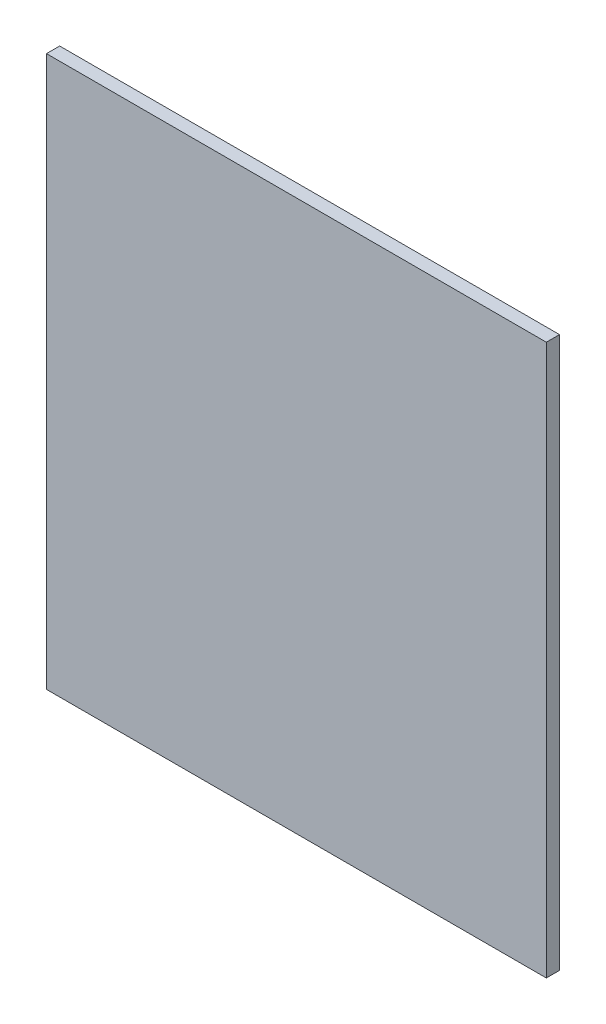
ISO-10303-21;
HEADER;
FILE_DESCRIPTION(('STEP AP214'),'2;1');
FILE_NAME('part.step','',(''),(''),'','','');
FILE_SCHEMA(('AUTOMOTIVE_DESIGN { 1 0 10303 214 1 1 1 1 }'));
ENDSEC;
DATA;
#1=APPLICATION_CONTEXT('core data for automotive mechanical design processes');
#2=APPLICATION_PROTOCOL_DEFINITION('international standard','automotive_design',2000,#1);
#3=PRODUCT_CONTEXT('',#1,'mechanical');
#4=PRODUCT('Part','Part','',(#3));
#5=PRODUCT_RELATED_PRODUCT_CATEGORY('part','',(#4));
#6=PRODUCT_DEFINITION_FORMATION('','',#4);
#7=PRODUCT_DEFINITION_CONTEXT('part definition',#1,'design');
#8=PRODUCT_DEFINITION('design','',#6,#7);
#9=PRODUCT_DEFINITION_SHAPE('','',#8);
#10=(LENGTH_UNIT() NAMED_UNIT(*) SI_UNIT(.MILLI.,.METRE.));
#11=(NAMED_UNIT(*) PLANE_ANGLE_UNIT() SI_UNIT($,.RADIAN.));
#12=(NAMED_UNIT(*) SI_UNIT($,.STERADIAN.) SOLID_ANGLE_UNIT());
#13=UNCERTAINTY_MEASURE_WITH_UNIT(LENGTH_MEASURE(1.E-05),#10,'distance_accuracy_value','');
#14=(GEOMETRIC_REPRESENTATION_CONTEXT(3) GLOBAL_UNCERTAINTY_ASSIGNED_CONTEXT((#13)) GLOBAL_UNIT_ASSIGNED_CONTEXT((#10,
#11,#12)) REPRESENTATION_CONTEXT('',''));
#15=CARTESIAN_POINT('',(0.,0.,0.));
#16=DIRECTION('',(0.,0.,1.));
#17=DIRECTION('',(1.,0.,0.));
#18=AXIS2_PLACEMENT_3D('',#15,#16,#17);
#19=CARTESIAN_POINT('',(0.,0.,2.));
#20=DIRECTION('',(1.,0.,0.));
#21=DIRECTION('',(0.,0.,-1.));
#22=AXIS2_PLACEMENT_3D('',#19,#20,#21);
#23=PLANE('',#22);
#24=DIRECTION('',(0.,-1.,0.));
#25=VECTOR('',#24,1.);
#26=CARTESIAN_POINT('',(0.,0.,0.));
#27=LINE('',#26,#25);
#28=CARTESIAN_POINT('',(0.,83.5,0.));
#29=VERTEX_POINT('',#28);
#30=CARTESIAN_POINT('',(0.,0.,0.));
#31=VERTEX_POINT('',#30);
#32=EDGE_CURVE('E96',#29,#31,#27,.T.);
#33=ORIENTED_EDGE('',*,*,#32,.T.);
#34=DIRECTION('',(0.,0.,-1.));
#35=VECTOR('',#34,1.);
#36=CARTESIAN_POINT('',(0.,0.,2.));
#37=LINE('',#36,#35);
#38=CARTESIAN_POINT('',(0.,0.,2.));
#39=VERTEX_POINT('',#38);
#40=EDGE_CURVE('E11',#39,#31,#37,.T.);
#41=ORIENTED_EDGE('',*,*,#40,.F.);
#42=DIRECTION('',(0.,-1.,0.));
#43=VECTOR('',#42,1.);
#44=CARTESIAN_POINT('',(0.,0.,2.));
#45=LINE('',#44,#43);
#46=CARTESIAN_POINT('',(0.,83.5,2.));
#47=VERTEX_POINT('',#46);
#48=EDGE_CURVE('E84',#47,#39,#45,.T.);
#49=ORIENTED_EDGE('',*,*,#48,.F.);
#50=DIRECTION('',(0.,0.,-1.));
#51=VECTOR('',#50,1.);
#52=CARTESIAN_POINT('',(0.,83.5,2.));
#53=LINE('',#52,#51);
#54=EDGE_CURVE('E92',#47,#29,#53,.T.);
#55=ORIENTED_EDGE('',*,*,#54,.T.);
#56=EDGE_LOOP('',(#33,#41,#49,#55));
#57=FACE_BOUND('',#56,.T.);
#58=ADVANCED_FACE('F33',(#57),#23,.F.);
#59=CARTESIAN_POINT('',(0.,0.,2.));
#60=DIRECTION('',(0.,1.,0.));
#61=DIRECTION('',(0.,0.,1.));
#62=AXIS2_PLACEMENT_3D('',#59,#60,#61);
#63=PLANE('',#62);
#64=DIRECTION('',(1.,0.,0.));
#65=VECTOR('',#64,1.);
#66=CARTESIAN_POINT('',(0.,0.,0.));
#67=LINE('',#66,#65);
#68=CARTESIAN_POINT('',(75.8,0.,0.));
#69=VERTEX_POINT('',#68);
#70=EDGE_CURVE('E88',#31,#69,#67,.T.);
#71=ORIENTED_EDGE('',*,*,#70,.T.);
#72=DIRECTION('',(0.,0.,-1.));
#73=VECTOR('',#72,1.);
#74=CARTESIAN_POINT('',(75.8,0.,2.));
#75=LINE('',#74,#73);
#76=CARTESIAN_POINT('',(75.8,0.,2.));
#77=VERTEX_POINT('',#76);
#78=EDGE_CURVE('E41',#77,#69,#75,.T.);
#79=ORIENTED_EDGE('',*,*,#78,.F.);
#80=DIRECTION('',(1.,0.,0.));
#81=VECTOR('',#80,1.);
#82=CARTESIAN_POINT('',(0.,0.,2.));
#83=LINE('',#82,#81);
#84=EDGE_CURVE('E79',#39,#77,#83,.T.);
#85=ORIENTED_EDGE('',*,*,#84,.F.);
#86=ORIENTED_EDGE('',*,*,#40,.T.);
#87=EDGE_LOOP('',(#71,#79,#85,#86));
#88=FACE_BOUND('',#87,.T.);
#89=ADVANCED_FACE('F87',(#88),#63,.F.);
#90=CARTESIAN_POINT('',(75.8,0.,2.));
#91=DIRECTION('',(-1.,0.,0.));
#92=DIRECTION('',(0.,0.,1.));
#93=AXIS2_PLACEMENT_3D('',#90,#91,#92);
#94=PLANE('',#93);
#95=DIRECTION('',(0.,1.,0.));
#96=VECTOR('',#95,1.);
#97=CARTESIAN_POINT('',(75.8,0.,0.));
#98=LINE('',#97,#96);
#99=CARTESIAN_POINT('',(75.8,83.5,0.));
#100=VERTEX_POINT('',#99);
#101=EDGE_CURVE('E66',#69,#100,#98,.T.);
#102=ORIENTED_EDGE('',*,*,#101,.T.);
#103=DIRECTION('',(0.,0.,-1.));
#104=VECTOR('',#103,1.);
#105=CARTESIAN_POINT('',(75.8,83.5,2.));
#106=LINE('',#105,#104);
#107=CARTESIAN_POINT('',(75.8,83.5,2.));
#108=VERTEX_POINT('',#107);
#109=EDGE_CURVE('E89',#108,#100,#106,.T.);
#110=ORIENTED_EDGE('',*,*,#109,.F.);
#111=DIRECTION('',(0.,1.,0.));
#112=VECTOR('',#111,1.);
#113=CARTESIAN_POINT('',(75.8,0.,2.));
#114=LINE('',#113,#112);
#115=EDGE_CURVE('E82',#77,#108,#114,.T.);
#116=ORIENTED_EDGE('',*,*,#115,.F.);
#117=ORIENTED_EDGE('',*,*,#78,.T.);
#118=EDGE_LOOP('',(#102,#110,#116,#117));
#119=FACE_BOUND('',#118,.T.);
#120=ADVANCED_FACE('F90',(#119),#94,.F.);
#121=CARTESIAN_POINT('',(0.,83.5,2.));
#122=DIRECTION('',(0.,-1.,0.));
#123=DIRECTION('',(0.,0.,-1.));
#124=AXIS2_PLACEMENT_3D('',#121,#122,#123);
#125=PLANE('',#124);
#126=DIRECTION('',(-1.,0.,0.));
#127=VECTOR('',#126,1.);
#128=CARTESIAN_POINT('',(0.,83.5,0.));
#129=LINE('',#128,#127);
#130=EDGE_CURVE('E72',#100,#29,#129,.T.);
#131=ORIENTED_EDGE('',*,*,#130,.T.);
#132=ORIENTED_EDGE('',*,*,#54,.F.);
#133=DIRECTION('',(-1.,0.,0.));
#134=VECTOR('',#133,1.);
#135=CARTESIAN_POINT('',(0.,83.5,2.));
#136=LINE('',#135,#134);
#137=EDGE_CURVE('E49',#108,#47,#136,.T.);
#138=ORIENTED_EDGE('',*,*,#137,.F.);
#139=ORIENTED_EDGE('',*,*,#109,.T.);
#140=EDGE_LOOP('',(#131,#132,#138,#139));
#141=FACE_BOUND('',#140,.T.);
#142=ADVANCED_FACE('F103',(#141),#125,.F.);
#143=CARTESIAN_POINT('',(0.,0.,2.));
#144=DIRECTION('',(0.,0.,-1.));
#145=DIRECTION('',(-1.,0.,0.));
#146=AXIS2_PLACEMENT_3D('',#143,#144,#145);
#147=PLANE('',#146);
#148=ORIENTED_EDGE('',*,*,#48,.T.);
#149=ORIENTED_EDGE('',*,*,#84,.T.);
#150=ORIENTED_EDGE('',*,*,#115,.T.);
#151=ORIENTED_EDGE('',*,*,#137,.T.);
#152=EDGE_LOOP('',(#148,#149,#150,#151));
#153=FACE_BOUND('',#152,.T.);
#154=ADVANCED_FACE('F80',(#153),#147,.F.);
#155=CARTESIAN_POINT('',(0.,0.,0.));
#156=DIRECTION('',(0.,0.,-1.));
#157=DIRECTION('',(-1.,0.,0.));
#158=AXIS2_PLACEMENT_3D('',#155,#156,#157);
#159=PLANE('',#158);
#160=ORIENTED_EDGE('',*,*,#32,.F.);
#161=ORIENTED_EDGE('',*,*,#130,.F.);
#162=ORIENTED_EDGE('',*,*,#101,.F.);
#163=ORIENTED_EDGE('',*,*,#70,.F.);
#164=EDGE_LOOP('',(#160,#161,#162,#163));
#165=FACE_BOUND('',#164,.T.);
#166=ADVANCED_FACE('F106',(#165),#159,.T.);
#167=CLOSED_SHELL('',(#58,#89,#120,#142,#154,#166));
#168=MANIFOLD_SOLID_BREP('B2',#167);
#169=ADVANCED_BREP_SHAPE_REPRESENTATION('',(#18,#168),#14);
#170=SHAPE_DEFINITION_REPRESENTATION(#9,#169);
ENDSEC;
END-ISO-10303-21;
